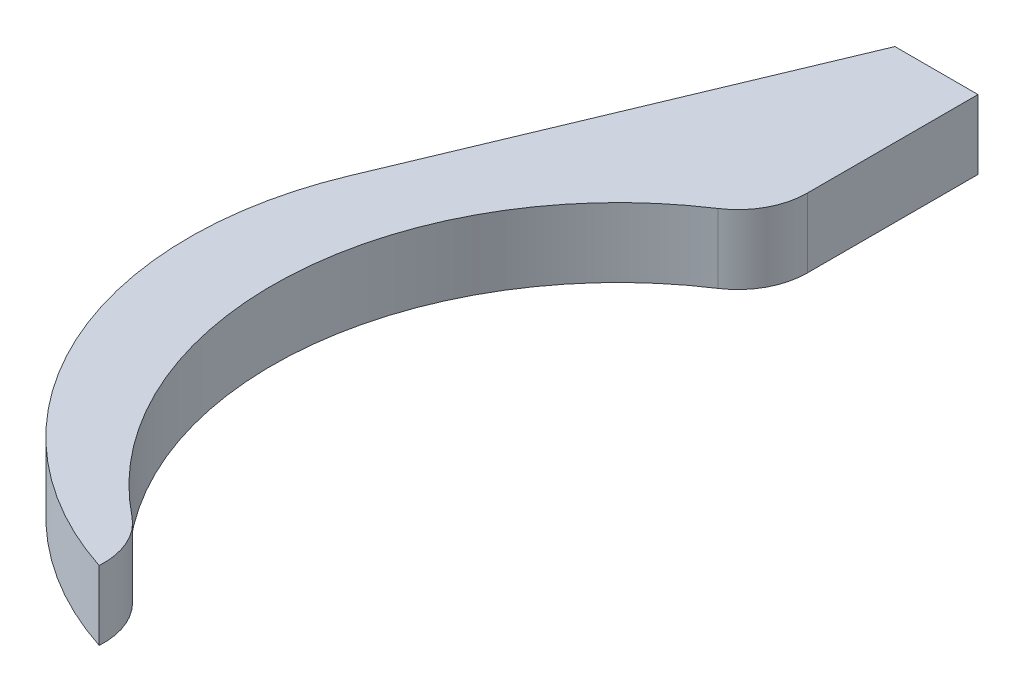
ISO-10303-21;
HEADER;
FILE_DESCRIPTION(('STEP AP214'),'2;1');
FILE_NAME('part.step','',(''),(''),'','','');
FILE_SCHEMA(('AUTOMOTIVE_DESIGN { 1 0 10303 214 1 1 1 1 }'));
ENDSEC;
DATA;
#1=APPLICATION_CONTEXT('core data for automotive mechanical design processes');
#2=APPLICATION_PROTOCOL_DEFINITION('international standard','automotive_design',2000,#1);
#3=PRODUCT_CONTEXT('',#1,'mechanical');
#4=PRODUCT('Part','Part','',(#3));
#5=PRODUCT_RELATED_PRODUCT_CATEGORY('part','',(#4));
#6=PRODUCT_DEFINITION_FORMATION('','',#4);
#7=PRODUCT_DEFINITION_CONTEXT('part definition',#1,'design');
#8=PRODUCT_DEFINITION('design','',#6,#7);
#9=PRODUCT_DEFINITION_SHAPE('','',#8);
#10=(LENGTH_UNIT() NAMED_UNIT(*) SI_UNIT(.MILLI.,.METRE.));
#11=(NAMED_UNIT(*) PLANE_ANGLE_UNIT() SI_UNIT($,.RADIAN.));
#12=(NAMED_UNIT(*) SI_UNIT($,.STERADIAN.) SOLID_ANGLE_UNIT());
#13=UNCERTAINTY_MEASURE_WITH_UNIT(LENGTH_MEASURE(1.E-05),#10,'distance_accuracy_value','');
#14=(GEOMETRIC_REPRESENTATION_CONTEXT(3) GLOBAL_UNCERTAINTY_ASSIGNED_CONTEXT((#13)) GLOBAL_UNIT_ASSIGNED_CONTEXT((#10,
#11,#12)) REPRESENTATION_CONTEXT('',''));
#15=CARTESIAN_POINT('',(0.,0.,0.));
#16=DIRECTION('',(0.,0.,1.));
#17=DIRECTION('',(1.,0.,0.));
#18=AXIS2_PLACEMENT_3D('',#15,#16,#17);
#19=CARTESIAN_POINT('',(8.4495202218953,0.,55.9700991059163));
#20=DIRECTION('',(0.,1.,0.));
#21=DIRECTION('',(0.,0.,1.));
#22=AXIS2_PLACEMENT_3D('',#19,#20,#21);
#23=CYLINDRICAL_SURFACE('',#22,25.);
#24=CARTESIAN_POINT('',(8.4495202218953,5.,55.9700991059163));
#25=DIRECTION('',(0.,1.,0.));
#26=DIRECTION('',(0.,0.,1.));
#27=AXIS2_PLACEMENT_3D('',#24,#25,#26);
#28=CIRCLE('',#27,25.);
#29=CARTESIAN_POINT('',(-14.6149676840736,5.,46.3249242689621));
#30=VERTEX_POINT('',#29);
#31=CARTESIAN_POINT('',(0.722500961257969,5.,79.7459939018171));
#32=VERTEX_POINT('',#31);
#33=EDGE_CURVE('E145',#30,#32,#28,.T.);
#34=ORIENTED_EDGE('',*,*,#33,.F.);
#35=DIRECTION('',(0.,1.,0.));
#36=VECTOR('',#35,1.);
#37=CARTESIAN_POINT('',(-14.6149676840736,0.,46.3249242689621));
#38=LINE('',#37,#36);
#39=CARTESIAN_POINT('',(-14.6149676840736,0.,46.3249242689621));
#40=VERTEX_POINT('',#39);
#41=EDGE_CURVE('E154',#40,#30,#38,.T.);
#42=ORIENTED_EDGE('',*,*,#41,.F.);
#43=CARTESIAN_POINT('',(8.4495202218953,0.,55.9700991059163));
#44=DIRECTION('',(0.,1.,0.));
#45=DIRECTION('',(0.,0.,1.));
#46=AXIS2_PLACEMENT_3D('',#43,#44,#45);
#47=CIRCLE('',#46,25.);
#48=CARTESIAN_POINT('',(0.722500961257969,0.,79.7459939018171));
#49=VERTEX_POINT('',#48);
#50=EDGE_CURVE('E127',#40,#49,#47,.T.);
#51=ORIENTED_EDGE('',*,*,#50,.T.);
#52=DIRECTION('',(0.,1.,0.));
#53=VECTOR('',#52,1.);
#54=CARTESIAN_POINT('',(0.722500961257969,0.,79.7459939018171));
#55=LINE('',#54,#53);
#56=EDGE_CURVE('E122',#49,#32,#55,.T.);
#57=ORIENTED_EDGE('',*,*,#56,.T.);
#58=EDGE_LOOP('',(#34,#42,#51,#57));
#59=FACE_BOUND('',#58,.T.);
#60=ADVANCED_FACE('F39',(#59),#23,.T.);
#61=CARTESIAN_POINT('',(3.,5.,3.35410196624968));
#62=DIRECTION('',(-1.,0.,0.));
#63=DIRECTION('',(0.,0.,1.));
#64=AXIS2_PLACEMENT_3D('',#61,#62,#63);
#65=PLANE('',#64);
#66=DIRECTION('',(0.,0.,-1.));
#67=VECTOR('',#66,1.);
#68=CARTESIAN_POINT('',(3.,0.,3.35410196624968));
#69=LINE('',#68,#67);
#70=CARTESIAN_POINT('',(3.00000000000001,0.,30.8819886854511));
#71=VERTEX_POINT('',#70);
#72=CARTESIAN_POINT('',(3.,0.,18.5500745429482));
#73=VERTEX_POINT('',#72);
#74=EDGE_CURVE('E113',#71,#73,#69,.T.);
#75=ORIENTED_EDGE('',*,*,#74,.T.);
#76=DIRECTION('',(0.,1.,0.));
#77=VECTOR('',#76,1.);
#78=CARTESIAN_POINT('',(3.,0.,18.5500745429482));
#79=LINE('',#78,#77);
#80=CARTESIAN_POINT('',(3.,5.,18.5500745429482));
#81=VERTEX_POINT('',#80);
#82=EDGE_CURVE('E95',#73,#81,#79,.T.);
#83=ORIENTED_EDGE('',*,*,#82,.T.);
#84=DIRECTION('',(0.,0.,-1.));
#85=VECTOR('',#84,1.);
#86=CARTESIAN_POINT('',(3.00000000000001,5.,43.8541019662497));
#87=LINE('',#86,#85);
#88=CARTESIAN_POINT('',(3.,5.,30.8819886854511));
#89=VERTEX_POINT('',#88);
#90=EDGE_CURVE('E121',#89,#81,#87,.T.);
#91=ORIENTED_EDGE('',*,*,#90,.F.);
#92=DIRECTION('',(0.,-1.,0.));
#93=VECTOR('',#92,1.);
#94=CARTESIAN_POINT('',(3.00000000000001,0.,30.8819886854511));
#95=LINE('',#94,#93);
#96=EDGE_CURVE('E120',#89,#71,#95,.T.);
#97=ORIENTED_EDGE('',*,*,#96,.T.);
#98=EDGE_LOOP('',(#75,#83,#91,#97));
#99=FACE_BOUND('',#98,.T.);
#100=ADVANCED_FACE('F118',(#99),#65,.F.);
#101=CARTESIAN_POINT('',(0.,5.,0.));
#102=DIRECTION('',(0.,1.,0.));
#103=DIRECTION('',(0.,0.,1.));
#104=AXIS2_PLACEMENT_3D('',#101,#102,#103);
#105=PLANE('',#104);
#106=DIRECTION('',(1.,0.,0.));
#107=VECTOR('',#106,1.);
#108=CARTESIAN_POINT('',(-3.,5.,18.5500745429482));
#109=LINE('',#108,#107);
#110=CARTESIAN_POINT('',(-3.,5.,18.5500745429482));
#111=VERTEX_POINT('',#110);
#112=EDGE_CURVE('E101',#111,#81,#109,.T.);
#113=ORIENTED_EDGE('',*,*,#112,.F.);
#114=DIRECTION('',(-0.38580699347817,0.,0.922579516238755));
#115=VECTOR('',#114,1.);
#116=CARTESIAN_POINT('',(-3.,5.,18.5500745429482));
#117=LINE('',#116,#115);
#118=EDGE_CURVE('E106',#111,#30,#117,.T.);
#119=ORIENTED_EDGE('',*,*,#118,.T.);
#120=ORIENTED_EDGE('',*,*,#33,.T.);
#121=CARTESIAN_POINT('',(-4.26659309038037,5.,79.4159324773719));
#122=DIRECTION('',(0.,1.,0.));
#123=DIRECTION('',(0.,0.,1.));
#124=AXIS2_PLACEMENT_3D('',#121,#122,#123);
#125=CIRCLE('',#124,5.);
#126=CARTESIAN_POINT('',(-1.14724087166777,5.,75.5082935821293));
#127=VERTEX_POINT('',#126);
#128=EDGE_CURVE('E61',#32,#127,#125,.T.);
#129=ORIENTED_EDGE('',*,*,#128,.T.);
#130=CARTESIAN_POINT('',(14.4495202218953,5.,55.9700991059163));
#131=DIRECTION('',(0.,-1.,0.));
#132=DIRECTION('',(0.,0.,1.));
#133=AXIS2_PLACEMENT_3D('',#130,#131,#132);
#134=CIRCLE('',#133,25.);
#135=CARTESIAN_POINT('',(0.741586703649219,5.,35.0633404221953));
#136=VERTEX_POINT('',#135);
#137=EDGE_CURVE('E144',#127,#136,#134,.T.);
#138=ORIENTED_EDGE('',*,*,#137,.T.);
#139=CARTESIAN_POINT('',(-1.99999999999999,5.,30.8819886854511));
#140=DIRECTION('',(0.,1.,0.));
#141=DIRECTION('',(0.,0.,1.));
#142=AXIS2_PLACEMENT_3D('',#139,#140,#141);
#143=CIRCLE('',#142,5.);
#144=EDGE_CURVE('E132',#136,#89,#143,.T.);
#145=ORIENTED_EDGE('',*,*,#144,.T.);
#146=ORIENTED_EDGE('',*,*,#90,.T.);
#147=EDGE_LOOP('',(#113,#119,#120,#129,#138,#145,#146));
#148=FACE_BOUND('',#147,.T.);
#149=ADVANCED_FACE('F167',(#148),#105,.T.);
#150=CARTESIAN_POINT('',(0.,0.,0.));
#151=DIRECTION('',(0.,1.,0.));
#152=DIRECTION('',(0.,0.,1.));
#153=AXIS2_PLACEMENT_3D('',#150,#151,#152);
#154=PLANE('',#153);
#155=DIRECTION('',(-0.38580699347817,0.,0.922579516238755));
#156=VECTOR('',#155,1.);
#157=CARTESIAN_POINT('',(-3.,0.,18.5500745429482));
#158=LINE('',#157,#156);
#159=CARTESIAN_POINT('',(-3.,0.,18.5500745429482));
#160=VERTEX_POINT('',#159);
#161=EDGE_CURVE('E116',#160,#40,#158,.T.);
#162=ORIENTED_EDGE('',*,*,#161,.F.);
#163=DIRECTION('',(1.,0.,0.));
#164=VECTOR('',#163,1.);
#165=CARTESIAN_POINT('',(-3.,0.,18.5500745429482));
#166=LINE('',#165,#164);
#167=EDGE_CURVE('E98',#160,#73,#166,.T.);
#168=ORIENTED_EDGE('',*,*,#167,.T.);
#169=ORIENTED_EDGE('',*,*,#74,.F.);
#170=CARTESIAN_POINT('',(-1.99999999999999,0.,30.8819886854511));
#171=DIRECTION('',(0.,1.,0.));
#172=DIRECTION('',(0.,0.,1.));
#173=AXIS2_PLACEMENT_3D('',#170,#171,#172);
#174=CIRCLE('',#173,5.);
#175=CARTESIAN_POINT('',(0.741586703649219,0.,35.0633404221953));
#176=VERTEX_POINT('',#175);
#177=EDGE_CURVE('E135',#71,#176,#174,.F.);
#178=ORIENTED_EDGE('',*,*,#177,.T.);
#179=CARTESIAN_POINT('',(14.4495202218953,0.,55.9700991059163));
#180=DIRECTION('',(0.,-1.,0.));
#181=DIRECTION('',(0.,0.,1.));
#182=AXIS2_PLACEMENT_3D('',#179,#180,#181);
#183=CIRCLE('',#182,25.);
#184=CARTESIAN_POINT('',(-1.14724087166776,0.,75.5082935821293));
#185=VERTEX_POINT('',#184);
#186=EDGE_CURVE('E138',#185,#176,#183,.T.);
#187=ORIENTED_EDGE('',*,*,#186,.F.);
#188=CARTESIAN_POINT('',(-4.26659309038037,0.,79.4159324773719));
#189=DIRECTION('',(0.,1.,0.));
#190=DIRECTION('',(0.,0.,1.));
#191=AXIS2_PLACEMENT_3D('',#188,#189,#190);
#192=CIRCLE('',#191,5.);
#193=EDGE_CURVE('E11',#185,#49,#192,.F.);
#194=ORIENTED_EDGE('',*,*,#193,.T.);
#195=ORIENTED_EDGE('',*,*,#50,.F.);
#196=EDGE_LOOP('',(#162,#168,#169,#178,#187,#194,#195));
#197=FACE_BOUND('',#196,.T.);
#198=ADVANCED_FACE('F111',(#197),#154,.F.);
#199=CARTESIAN_POINT('',(14.4495202218953,0.,55.9700991059163));
#200=DIRECTION('',(0.,1.,0.));
#201=DIRECTION('',(0.,0.,1.));
#202=AXIS2_PLACEMENT_3D('',#199,#200,#201);
#203=CYLINDRICAL_SURFACE('',#202,25.);
#204=ORIENTED_EDGE('',*,*,#137,.F.);
#205=DIRECTION('',(0.,1.,0.));
#206=VECTOR('',#205,1.);
#207=CARTESIAN_POINT('',(-1.14724087166777,0.,75.5082935821293));
#208=LINE('',#207,#206);
#209=EDGE_CURVE('E47',#127,#185,#208,.F.);
#210=ORIENTED_EDGE('',*,*,#209,.T.);
#211=ORIENTED_EDGE('',*,*,#186,.T.);
#212=DIRECTION('',(0.,1.,0.));
#213=VECTOR('',#212,1.);
#214=CARTESIAN_POINT('',(0.741586703649219,0.,35.0633404221953));
#215=LINE('',#214,#213);
#216=EDGE_CURVE('E124',#176,#136,#215,.T.);
#217=ORIENTED_EDGE('',*,*,#216,.T.);
#218=EDGE_LOOP('',(#204,#210,#211,#217));
#219=FACE_BOUND('',#218,.T.);
#220=ADVANCED_FACE('F143',(#219),#203,.F.);
#221=CARTESIAN_POINT('',(-3.,0.,18.5500745429482));
#222=DIRECTION('',(-0.922579516238755,0.,-0.38580699347817));
#223=DIRECTION('',(-0.38580699347817,0.,0.922579516238755));
#224=AXIS2_PLACEMENT_3D('',#221,#222,#223);
#225=PLANE('',#224);
#226=ORIENTED_EDGE('',*,*,#118,.F.);
#227=DIRECTION('',(0.,1.,0.));
#228=VECTOR('',#227,1.);
#229=CARTESIAN_POINT('',(-3.,0.,18.5500745429482));
#230=LINE('',#229,#228);
#231=EDGE_CURVE('E151',#160,#111,#230,.T.);
#232=ORIENTED_EDGE('',*,*,#231,.F.);
#233=ORIENTED_EDGE('',*,*,#161,.T.);
#234=ORIENTED_EDGE('',*,*,#41,.T.);
#235=EDGE_LOOP('',(#226,#232,#233,#234));
#236=FACE_BOUND('',#235,.T.);
#237=ADVANCED_FACE('F163',(#236),#225,.T.);
#238=CARTESIAN_POINT('',(-1.99999999999999,0.,30.8819886854511));
#239=DIRECTION('',(0.,1.,0.));
#240=DIRECTION('',(0.,0.,1.));
#241=AXIS2_PLACEMENT_3D('',#238,#239,#240);
#242=CYLINDRICAL_SURFACE('',#241,5.);
#243=ORIENTED_EDGE('',*,*,#177,.F.);
#244=ORIENTED_EDGE('',*,*,#96,.F.);
#245=ORIENTED_EDGE('',*,*,#144,.F.);
#246=ORIENTED_EDGE('',*,*,#216,.F.);
#247=EDGE_LOOP('',(#243,#244,#245,#246));
#248=FACE_BOUND('',#247,.T.);
#249=ADVANCED_FACE('F142',(#248),#242,.T.);
#250=CARTESIAN_POINT('',(-4.26659309038037,0.,79.4159324773719));
#251=DIRECTION('',(0.,1.,0.));
#252=DIRECTION('',(0.,0.,1.));
#253=AXIS2_PLACEMENT_3D('',#250,#251,#252);
#254=CYLINDRICAL_SURFACE('',#253,5.);
#255=ORIENTED_EDGE('',*,*,#193,.F.);
#256=ORIENTED_EDGE('',*,*,#209,.F.);
#257=ORIENTED_EDGE('',*,*,#128,.F.);
#258=ORIENTED_EDGE('',*,*,#56,.F.);
#259=EDGE_LOOP('',(#255,#256,#257,#258));
#260=FACE_BOUND('',#259,.T.);
#261=ADVANCED_FACE('F41',(#260),#254,.T.);
#262=CARTESIAN_POINT('',(-3.,0.,18.5500745429482));
#263=DIRECTION('',(0.,0.,1.));
#264=DIRECTION('',(1.,0.,0.));
#265=AXIS2_PLACEMENT_3D('',#262,#263,#264);
#266=PLANE('',#265);
#267=ORIENTED_EDGE('',*,*,#112,.T.);
#268=ORIENTED_EDGE('',*,*,#82,.F.);
#269=ORIENTED_EDGE('',*,*,#167,.F.);
#270=ORIENTED_EDGE('',*,*,#231,.T.);
#271=EDGE_LOOP('',(#267,#268,#269,#270));
#272=FACE_BOUND('',#271,.T.);
#273=ADVANCED_FACE('F97',(#272),#266,.F.);
#274=CLOSED_SHELL('',(#60,#100,#149,#198,#220,#237,#249,#261,#273));
#275=MANIFOLD_SOLID_BREP('B2',#274);
#276=ADVANCED_BREP_SHAPE_REPRESENTATION('',(#18,#275),#14);
#277=SHAPE_DEFINITION_REPRESENTATION(#9,#276);
ENDSEC;
END-ISO-10303-21;
